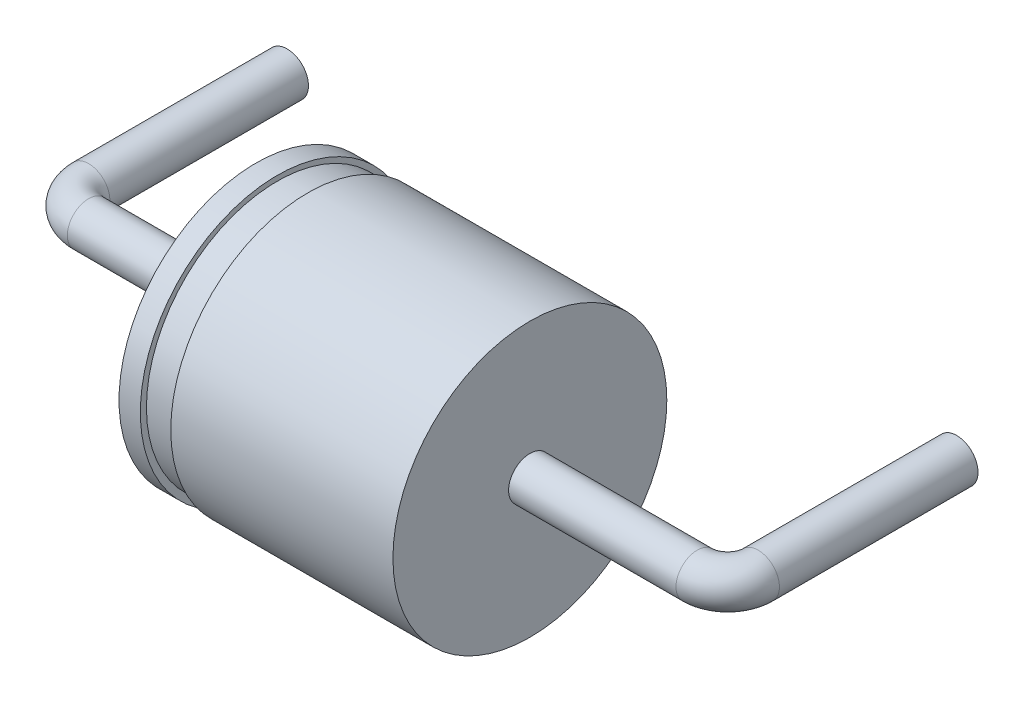
ISO-10303-21;
HEADER;
FILE_DESCRIPTION(('STEP AP214'),'2;1');
FILE_NAME('part.step','',(''),(''),'','','');
FILE_SCHEMA(('AUTOMOTIVE_DESIGN { 1 0 10303 214 1 1 1 1 }'));
ENDSEC;
DATA;
#1=APPLICATION_CONTEXT('core data for automotive mechanical design processes');
#2=APPLICATION_PROTOCOL_DEFINITION('international standard','automotive_design',2000,#1);
#3=PRODUCT_CONTEXT('',#1,'mechanical');
#4=PRODUCT('Part','Part','',(#3));
#5=PRODUCT_RELATED_PRODUCT_CATEGORY('part','',(#4));
#6=PRODUCT_DEFINITION_FORMATION('','',#4);
#7=PRODUCT_DEFINITION_CONTEXT('part definition',#1,'design');
#8=PRODUCT_DEFINITION('design','',#6,#7);
#9=PRODUCT_DEFINITION_SHAPE('','',#8);
#10=(LENGTH_UNIT() NAMED_UNIT(*) SI_UNIT(.MILLI.,.METRE.));
#11=(NAMED_UNIT(*) PLANE_ANGLE_UNIT() SI_UNIT($,.RADIAN.));
#12=(NAMED_UNIT(*) SI_UNIT($,.STERADIAN.) SOLID_ANGLE_UNIT());
#13=UNCERTAINTY_MEASURE_WITH_UNIT(LENGTH_MEASURE(1.E-05),#10,'distance_accuracy_value','');
#14=(GEOMETRIC_REPRESENTATION_CONTEXT(3) GLOBAL_UNCERTAINTY_ASSIGNED_CONTEXT((#13)) GLOBAL_UNIT_ASSIGNED_CONTEXT((#10,
#11,#12)) REPRESENTATION_CONTEXT('',''));
#15=CARTESIAN_POINT('',(0.,0.,0.));
#16=DIRECTION('',(0.,0.,1.));
#17=DIRECTION('',(1.,0.,0.));
#18=AXIS2_PLACEMENT_3D('',#15,#16,#17);
#19=CARTESIAN_POINT('',(1.,0.,1.525));
#20=DIRECTION('',(1.,0.,0.));
#21=DIRECTION('',(0.,0.,-1.));
#22=AXIS2_PLACEMENT_3D('',#19,#20,#21);
#23=CYLINDRICAL_SURFACE('',#22,0.7);
#24=CARTESIAN_POINT('',(1.,0.,1.525));
#25=DIRECTION('',(1.,0.,0.));
#26=DIRECTION('',(0.,0.,-1.));
#27=AXIS2_PLACEMENT_3D('',#24,#25,#26);
#28=CIRCLE('',#27,0.7);
#29=CARTESIAN_POINT('',(1.,0.,2.225));
#30=VERTEX_POINT('',#29);
#31=EDGE_CURVE('E49',#30,#30,#28,.T.);
#32=ORIENTED_EDGE('',*,*,#31,.T.);
#33=EDGE_LOOP('',(#32));
#34=FACE_BOUND('',#33,.T.);
#35=CARTESIAN_POINT('',(6.5,0.,1.525));
#36=DIRECTION('',(1.,0.,0.));
#37=DIRECTION('',(0.,0.,-1.));
#38=AXIS2_PLACEMENT_3D('',#35,#36,#37);
#39=CIRCLE('',#38,0.7);
#40=CARTESIAN_POINT('',(6.5,0.,0.825));
#41=VERTEX_POINT('',#40);
#42=EDGE_CURVE('E33',#41,#41,#39,.F.);
#43=ORIENTED_EDGE('',*,*,#42,.T.);
#44=EDGE_LOOP('',(#43));
#45=FACE_BOUND('',#44,.T.);
#46=ADVANCED_FACE('F29',(#34,#45),#23,.T.);
#47=CARTESIAN_POINT('',(1.,0.,0.525));
#48=DIRECTION('',(0.,1.,0.));
#49=DIRECTION('',(0.,0.,1.));
#50=AXIS2_PLACEMENT_3D('',#47,#48,#49);
#51=TOROIDAL_SURFACE('',#50,1.,0.7);
#52=CARTESIAN_POINT('',(0.,0.,0.525));
#53=DIRECTION('',(0.,0.,1.));
#54=DIRECTION('',(1.,0.,0.));
#55=AXIS2_PLACEMENT_3D('',#52,#53,#54);
#56=CIRCLE('',#55,0.7);
#57=CARTESIAN_POINT('',(-0.7,0.,0.525));
#58=VERTEX_POINT('',#57);
#59=EDGE_CURVE('E52',#58,#58,#56,.T.);
#60=CARTESIAN_POINT('',(1.,0.,0.525));
#61=DIRECTION('',(0.,1.,0.));
#62=DIRECTION('',(0.,0.,1.));
#63=AXIS2_PLACEMENT_3D('',#60,#61,#62);
#64=CIRCLE('',#63,1.7);
#65=EDGE_CURVE('',#58,#30,#64,.T.);
#66=ORIENTED_EDGE('',*,*,#59,.T.);
#67=ORIENTED_EDGE('',*,*,#31,.F.);
#68=ORIENTED_EDGE('',*,*,#65,.T.);
#69=ORIENTED_EDGE('',*,*,#65,.F.);
#70=EDGE_LOOP('',(#66,#68,#67,#69));
#71=FACE_BOUND('',#70,.T.);
#72=ADVANCED_FACE('F108',(#71),#51,.T.);
#73=CARTESIAN_POINT('',(0.,0.,0.525));
#74=DIRECTION('',(0.,0.,-1.));
#75=DIRECTION('',(-1.,0.,0.));
#76=AXIS2_PLACEMENT_3D('',#73,#74,#75);
#77=CYLINDRICAL_SURFACE('',#76,0.7);
#78=ORIENTED_EDGE('',*,*,#59,.F.);
#79=EDGE_LOOP('',(#78));
#80=FACE_BOUND('',#79,.T.);
#81=CARTESIAN_POINT('',(0.,0.,-6.));
#82=DIRECTION('',(0.,0.,1.));
#83=DIRECTION('',(1.,0.,0.));
#84=AXIS2_PLACEMENT_3D('',#81,#82,#83);
#85=CIRCLE('',#84,0.7);
#86=CARTESIAN_POINT('',(0.7,0.,-6.));
#87=VERTEX_POINT('',#86);
#88=EDGE_CURVE('E55',#87,#87,#85,.T.);
#89=ORIENTED_EDGE('',*,*,#88,.T.);
#90=EDGE_LOOP('',(#89));
#91=FACE_BOUND('',#90,.T.);
#92=ADVANCED_FACE('F115',(#80,#91),#77,.T.);
#93=CARTESIAN_POINT('',(0.,0.,-6.));
#94=DIRECTION('',(0.,0.,1.));
#95=DIRECTION('',(1.,0.,0.));
#96=AXIS2_PLACEMENT_3D('',#93,#94,#95);
#97=PLANE('',#96);
#98=ORIENTED_EDGE('',*,*,#88,.F.);
#99=EDGE_LOOP('',(#98));
#100=FACE_BOUND('',#99,.T.);
#101=ADVANCED_FACE('F105',(#100),#97,.F.);
#102=CARTESIAN_POINT('',(15.5,-0.0336492653327545,1.525));
#103=DIRECTION('',(-1.,0.,0.));
#104=DIRECTION('',(0.,0.,1.));
#105=AXIS2_PLACEMENT_3D('',#102,#103,#104);
#106=CYLINDRICAL_SURFACE('',#105,4.5);
#107=CARTESIAN_POINT('',(6.5,-0.0336492653327545,1.525));
#108=DIRECTION('',(1.,0.,0.));
#109=DIRECTION('',(0.,0.,-1.));
#110=AXIS2_PLACEMENT_3D('',#107,#108,#109);
#111=CIRCLE('',#110,4.5);
#112=CARTESIAN_POINT('',(6.5,-0.0336492653327545,-2.975));
#113=VERTEX_POINT('',#112);
#114=EDGE_CURVE('E61',#113,#113,#111,.T.);
#115=ORIENTED_EDGE('',*,*,#114,.T.);
#116=EDGE_LOOP('',(#115));
#117=FACE_BOUND('',#116,.T.);
#118=CARTESIAN_POINT('',(7.2,-0.0336492653327545,1.525));
#119=DIRECTION('',(1.,0.,0.));
#120=DIRECTION('',(0.,0.,-1.));
#121=AXIS2_PLACEMENT_3D('',#118,#119,#120);
#122=CIRCLE('',#121,4.5);
#123=CARTESIAN_POINT('',(7.2,-0.0336492653327545,-2.975));
#124=VERTEX_POINT('',#123);
#125=EDGE_CURVE('E58',#124,#124,#122,.T.);
#126=ORIENTED_EDGE('',*,*,#125,.F.);
#127=EDGE_LOOP('',(#126));
#128=FACE_BOUND('',#127,.T.);
#129=ADVANCED_FACE('F93',(#117,#128),#106,.T.);
#130=CARTESIAN_POINT('',(6.5,-0.0336492653327545,1.525));
#131=DIRECTION('',(1.,0.,0.));
#132=DIRECTION('',(0.,0.,-1.));
#133=AXIS2_PLACEMENT_3D('',#130,#131,#132);
#134=PLANE('',#133);
#135=ORIENTED_EDGE('',*,*,#42,.F.);
#136=EDGE_LOOP('',(#135));
#137=FACE_BOUND('',#136,.T.);
#138=ORIENTED_EDGE('',*,*,#114,.F.);
#139=EDGE_LOOP('',(#138));
#140=FACE_BOUND('',#139,.T.);
#141=ADVANCED_FACE('F104',(#137,#140),#134,.F.);
#142=CARTESIAN_POINT('',(7.2,0.,-3.075));
#143=DIRECTION('',(1.,0.,0.));
#144=DIRECTION('',(0.,0.,-1.));
#145=AXIS2_PLACEMENT_3D('',#142,#143,#144);
#146=PLANE('',#145);
#147=CARTESIAN_POINT('',(7.2,0.,1.525));
#148=DIRECTION('',(-1.,0.,0.));
#149=DIRECTION('',(0.,0.,1.));
#150=AXIS2_PLACEMENT_3D('',#147,#148,#149);
#151=CIRCLE('',#150,4.3);
#152=CARTESIAN_POINT('',(7.2,0.,5.825));
#153=VERTEX_POINT('',#152);
#154=EDGE_CURVE('E65',#153,#153,#151,.T.);
#155=ORIENTED_EDGE('',*,*,#154,.T.);
#156=EDGE_LOOP('',(#155));
#157=FACE_BOUND('',#156,.T.);
#158=ORIENTED_EDGE('',*,*,#125,.T.);
#159=EDGE_LOOP('',(#158));
#160=FACE_BOUND('',#159,.T.);
#161=ADVANCED_FACE('F83',(#157,#160),#146,.T.);
#162=CARTESIAN_POINT('',(8.2,0.,-3.075));
#163=DIRECTION('',(-1.,0.,0.));
#164=DIRECTION('',(0.,0.,1.));
#165=AXIS2_PLACEMENT_3D('',#162,#163,#164);
#166=PLANE('',#165);
#167=CARTESIAN_POINT('',(8.2,0.,1.525));
#168=DIRECTION('',(-1.,0.,0.));
#169=DIRECTION('',(0.,0.,1.));
#170=AXIS2_PLACEMENT_3D('',#167,#168,#169);
#171=CIRCLE('',#170,4.3);
#172=CARTESIAN_POINT('',(8.2,0.,5.825));
#173=VERTEX_POINT('',#172);
#174=EDGE_CURVE('E73',#173,#173,#171,.T.);
#175=ORIENTED_EDGE('',*,*,#174,.F.);
#176=EDGE_LOOP('',(#175));
#177=FACE_BOUND('',#176,.T.);
#178=CARTESIAN_POINT('',(8.2,-0.0336492653327545,1.525));
#179=DIRECTION('',(-1.,0.,0.));
#180=DIRECTION('',(0.,0.,1.));
#181=AXIS2_PLACEMENT_3D('',#178,#179,#180);
#182=CIRCLE('',#181,4.5);
#183=CARTESIAN_POINT('',(8.2,-0.0336492653327545,6.025));
#184=VERTEX_POINT('',#183);
#185=EDGE_CURVE('E62',#184,#184,#182,.T.);
#186=ORIENTED_EDGE('',*,*,#185,.T.);
#187=EDGE_LOOP('',(#186));
#188=FACE_BOUND('',#187,.T.);
#189=ADVANCED_FACE('F80',(#177,#188),#166,.T.);
#190=CARTESIAN_POINT('',(0.,0.,1.525));
#191=DIRECTION('',(-1.,0.,0.));
#192=DIRECTION('',(0.,0.,1.));
#193=AXIS2_PLACEMENT_3D('',#190,#191,#192);
#194=CYLINDRICAL_SURFACE('',#193,4.3);
#195=ORIENTED_EDGE('',*,*,#174,.T.);
#196=EDGE_LOOP('',(#195));
#197=FACE_BOUND('',#196,.T.);
#198=ORIENTED_EDGE('',*,*,#154,.F.);
#199=EDGE_LOOP('',(#198));
#200=FACE_BOUND('',#199,.T.);
#201=ADVANCED_FACE('F77',(#197,#200),#194,.T.);
#202=CARTESIAN_POINT('',(15.5,-0.0336492653327545,1.525));
#203=DIRECTION('',(1.,0.,0.));
#204=DIRECTION('',(0.,0.,-1.));
#205=AXIS2_PLACEMENT_3D('',#202,#203,#204);
#206=PLANE('',#205);
#207=CARTESIAN_POINT('',(15.5,0.,1.525));
#208=DIRECTION('',(1.,0.,0.));
#209=DIRECTION('',(0.,0.,-1.));
#210=AXIS2_PLACEMENT_3D('',#207,#208,#209);
#211=CIRCLE('',#210,0.7);
#212=CARTESIAN_POINT('',(15.5,0.,0.825));
#213=VERTEX_POINT('',#212);
#214=EDGE_CURVE('E10',#213,#213,#211,.F.);
#215=ORIENTED_EDGE('',*,*,#214,.T.);
#216=EDGE_LOOP('',(#215));
#217=FACE_BOUND('',#216,.T.);
#218=CARTESIAN_POINT('',(15.5,-0.0336492653327545,1.525));
#219=DIRECTION('',(1.,0.,0.));
#220=DIRECTION('',(0.,0.,-1.));
#221=AXIS2_PLACEMENT_3D('',#218,#219,#220);
#222=CIRCLE('',#221,4.5);
#223=CARTESIAN_POINT('',(15.5,-0.0336492653327545,-2.975));
#224=VERTEX_POINT('',#223);
#225=EDGE_CURVE('E68',#224,#224,#222,.T.);
#226=ORIENTED_EDGE('',*,*,#225,.T.);
#227=EDGE_LOOP('',(#226));
#228=FACE_BOUND('',#227,.T.);
#229=ADVANCED_FACE('F90',(#217,#228),#206,.T.);
#230=ORIENTED_EDGE('',*,*,#225,.F.);
#231=EDGE_LOOP('',(#230));
#232=FACE_BOUND('',#231,.T.);
#233=ORIENTED_EDGE('',*,*,#185,.F.);
#234=EDGE_LOOP('',(#233));
#235=FACE_BOUND('',#234,.T.);
#236=ADVANCED_FACE('F87',(#232,#235),#106,.T.);
#237=CARTESIAN_POINT('',(22.,0.,-6.));
#238=DIRECTION('',(0.,0.,-1.));
#239=DIRECTION('',(-1.,0.,0.));
#240=AXIS2_PLACEMENT_3D('',#237,#238,#239);
#241=PLANE('',#240);
#242=CARTESIAN_POINT('',(22.,0.,-6.));
#243=DIRECTION('',(0.,0.,1.));
#244=DIRECTION('',(-1.,0.,0.));
#245=AXIS2_PLACEMENT_3D('',#242,#243,#244);
#246=CIRCLE('',#245,0.699999999999998);
#247=CARTESIAN_POINT('',(21.3,0.,-6.));
#248=VERTEX_POINT('',#247);
#249=EDGE_CURVE('E37',#248,#248,#246,.T.);
#250=ORIENTED_EDGE('',*,*,#249,.F.);
#251=EDGE_LOOP('',(#250));
#252=FACE_BOUND('',#251,.T.);
#253=ADVANCED_FACE('F89',(#252),#241,.T.);
#254=CARTESIAN_POINT('',(22.,0.,-6.));
#255=DIRECTION('',(0.,0.,1.));
#256=DIRECTION('',(1.,0.,0.));
#257=AXIS2_PLACEMENT_3D('',#254,#255,#256);
#258=CYLINDRICAL_SURFACE('',#257,0.699999999999998);
#259=ORIENTED_EDGE('',*,*,#249,.T.);
#260=EDGE_LOOP('',(#259));
#261=FACE_BOUND('',#260,.T.);
#262=CARTESIAN_POINT('',(22.,0.,0.525000000000001));
#263=DIRECTION('',(0.,0.,-1.));
#264=DIRECTION('',(-1.,0.,0.));
#265=AXIS2_PLACEMENT_3D('',#262,#263,#264);
#266=CIRCLE('',#265,0.7);
#267=CARTESIAN_POINT('',(22.7,0.,0.525000000000002));
#268=VERTEX_POINT('',#267);
#269=EDGE_CURVE('E41',#268,#268,#266,.T.);
#270=ORIENTED_EDGE('',*,*,#269,.T.);
#271=EDGE_LOOP('',(#270));
#272=FACE_BOUND('',#271,.T.);
#273=ADVANCED_FACE('F31',(#261,#272),#258,.T.);
#274=CARTESIAN_POINT('',(21.,0.,0.525));
#275=DIRECTION('',(0.,1.,0.));
#276=DIRECTION('',(0.,0.,1.));
#277=AXIS2_PLACEMENT_3D('',#274,#275,#276);
#278=TOROIDAL_SURFACE('',#277,1.,0.7);
#279=CARTESIAN_POINT('',(21.,0.,1.525));
#280=DIRECTION('',(1.,0.,0.));
#281=DIRECTION('',(0.,0.,-1.));
#282=AXIS2_PLACEMENT_3D('',#279,#280,#281);
#283=CIRCLE('',#282,0.7);
#284=CARTESIAN_POINT('',(21.,0.,2.225));
#285=VERTEX_POINT('',#284);
#286=EDGE_CURVE('E46',#285,#285,#283,.T.);
#287=CARTESIAN_POINT('',(21.,0.,0.525));
#288=DIRECTION('',(0.,1.,0.));
#289=DIRECTION('',(0.,0.,1.));
#290=AXIS2_PLACEMENT_3D('',#287,#288,#289);
#291=CIRCLE('',#290,1.7);
#292=EDGE_CURVE('',#285,#268,#291,.T.);
#293=ORIENTED_EDGE('',*,*,#286,.T.);
#294=ORIENTED_EDGE('',*,*,#269,.F.);
#295=ORIENTED_EDGE('',*,*,#292,.T.);
#296=ORIENTED_EDGE('',*,*,#292,.F.);
#297=EDGE_LOOP('',(#293,#295,#294,#296));
#298=FACE_BOUND('',#297,.T.);
#299=ADVANCED_FACE('F121',(#298),#278,.T.);
#300=ORIENTED_EDGE('',*,*,#214,.F.);
#301=EDGE_LOOP('',(#300));
#302=FACE_BOUND('',#301,.T.);
#303=ORIENTED_EDGE('',*,*,#286,.F.);
#304=EDGE_LOOP('',(#303));
#305=FACE_BOUND('',#304,.T.);
#306=ADVANCED_FACE('F111',(#302,#305),#23,.T.);
#307=CLOSED_SHELL('',(#46,#72,#92,#101,#129,#141,#161,#189,#201,#229,#236,#253,#273,#299,#306));
#308=MANIFOLD_SOLID_BREP('B2',#307);
#309=ADVANCED_BREP_SHAPE_REPRESENTATION('',(#18,#308),#14);
#310=SHAPE_DEFINITION_REPRESENTATION(#9,#309);
ENDSEC;
END-ISO-10303-21;
